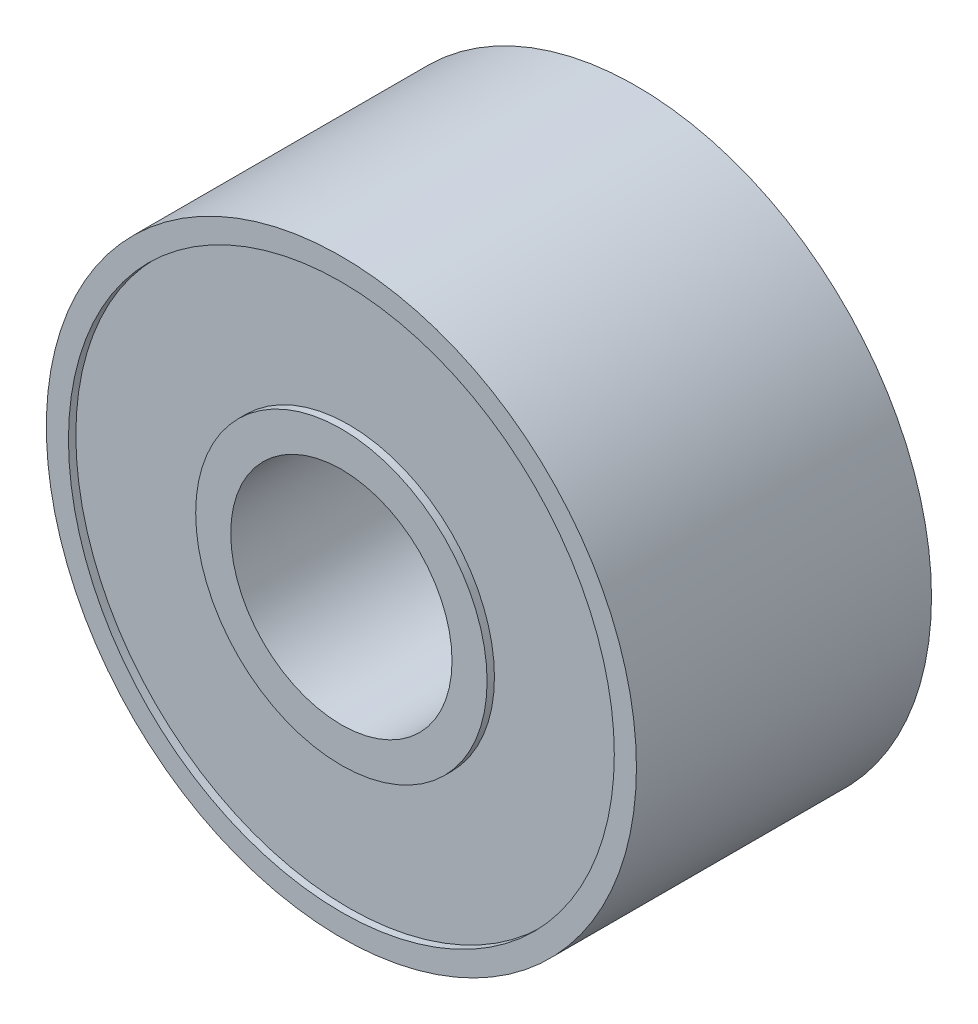
ISO-10303-21;
HEADER;
FILE_DESCRIPTION(('STEP AP214'),'2;1');
FILE_NAME('part.step','',(''),(''),'','','');
FILE_SCHEMA(('AUTOMOTIVE_DESIGN { 1 0 10303 214 1 1 1 1 }'));
ENDSEC;
DATA;
#1=APPLICATION_CONTEXT('core data for automotive mechanical design processes');
#2=APPLICATION_PROTOCOL_DEFINITION('international standard','automotive_design',2000,#1);
#3=PRODUCT_CONTEXT('',#1,'mechanical');
#4=PRODUCT('Part','Part','',(#3));
#5=PRODUCT_RELATED_PRODUCT_CATEGORY('part','',(#4));
#6=PRODUCT_DEFINITION_FORMATION('','',#4);
#7=PRODUCT_DEFINITION_CONTEXT('part definition',#1,'design');
#8=PRODUCT_DEFINITION('design','',#6,#7);
#9=PRODUCT_DEFINITION_SHAPE('','',#8);
#10=(LENGTH_UNIT() NAMED_UNIT(*) SI_UNIT(.MILLI.,.METRE.));
#11=(NAMED_UNIT(*) PLANE_ANGLE_UNIT() SI_UNIT($,.RADIAN.));
#12=(NAMED_UNIT(*) SI_UNIT($,.STERADIAN.) SOLID_ANGLE_UNIT());
#13=UNCERTAINTY_MEASURE_WITH_UNIT(LENGTH_MEASURE(1.E-05),#10,'distance_accuracy_value','');
#14=(GEOMETRIC_REPRESENTATION_CONTEXT(3) GLOBAL_UNCERTAINTY_ASSIGNED_CONTEXT((#13)) GLOBAL_UNIT_ASSIGNED_CONTEXT((#10,
#11,#12)) REPRESENTATION_CONTEXT('',''));
#15=CARTESIAN_POINT('',(0.,0.,0.));
#16=DIRECTION('',(0.,0.,1.));
#17=DIRECTION('',(1.,0.,0.));
#18=AXIS2_PLACEMENT_3D('',#15,#16,#17);
#19=CARTESIAN_POINT('',(0.,0.,0.));
#20=DIRECTION('',(0.,0.,1.));
#21=DIRECTION('',(1.,0.,0.));
#22=AXIS2_PLACEMENT_3D('',#19,#20,#21);
#23=PLANE('',#22);
#24=CARTESIAN_POINT('',(0.,0.,0.));
#25=DIRECTION('',(0.,0.,1.));
#26=DIRECTION('',(1.,0.,0.));
#27=AXIS2_PLACEMENT_3D('',#24,#25,#26);
#28=CIRCLE('',#27,1.5);
#29=CARTESIAN_POINT('',(1.5,0.,0.));
#30=VERTEX_POINT('',#29);
#31=EDGE_CURVE('E43',#30,#30,#28,.T.);
#32=ORIENTED_EDGE('',*,*,#31,.T.);
#33=EDGE_LOOP('',(#32));
#34=FACE_BOUND('',#33,.T.);
#35=CARTESIAN_POINT('',(0.,0.,0.));
#36=DIRECTION('',(0.,0.,-1.));
#37=DIRECTION('',(-1.,0.,0.));
#38=AXIS2_PLACEMENT_3D('',#35,#36,#37);
#39=CIRCLE('',#38,1.97517800346251);
#40=CARTESIAN_POINT('',(-1.97517800346251,0.,0.));
#41=VERTEX_POINT('',#40);
#42=EDGE_CURVE('E65',#41,#41,#39,.T.);
#43=ORIENTED_EDGE('',*,*,#42,.T.);
#44=EDGE_LOOP('',(#43));
#45=FACE_BOUND('',#44,.T.);
#46=ADVANCED_FACE('F30',(#34,#45),#23,.F.);
#47=CARTESIAN_POINT('',(0.,0.,4.));
#48=DIRECTION('',(0.,0.,1.));
#49=DIRECTION('',(1.,0.,0.));
#50=AXIS2_PLACEMENT_3D('',#47,#48,#49);
#51=PLANE('',#50);
#52=CARTESIAN_POINT('',(0.,0.,4.));
#53=DIRECTION('',(0.,0.,1.));
#54=DIRECTION('',(1.,0.,0.));
#55=AXIS2_PLACEMENT_3D('',#52,#53,#54);
#56=CIRCLE('',#55,1.5);
#57=CARTESIAN_POINT('',(1.5,0.,4.));
#58=VERTEX_POINT('',#57);
#59=EDGE_CURVE('E41',#58,#58,#56,.T.);
#60=ORIENTED_EDGE('',*,*,#59,.F.);
#61=EDGE_LOOP('',(#60));
#62=FACE_BOUND('',#61,.T.);
#63=CARTESIAN_POINT('',(0.,0.,4.));
#64=DIRECTION('',(0.,0.,1.));
#65=DIRECTION('',(1.,0.,0.));
#66=AXIS2_PLACEMENT_3D('',#63,#64,#65);
#67=CIRCLE('',#66,1.97517800346251);
#68=CARTESIAN_POINT('',(1.97517800346251,0.,4.));
#69=VERTEX_POINT('',#68);
#70=EDGE_CURVE('E55',#69,#69,#67,.T.);
#71=ORIENTED_EDGE('',*,*,#70,.T.);
#72=EDGE_LOOP('',(#71));
#73=FACE_BOUND('',#72,.T.);
#74=ADVANCED_FACE('F104',(#62,#73),#51,.T.);
#75=CARTESIAN_POINT('',(0.,0.,4.));
#76=DIRECTION('',(0.,0.,1.));
#77=DIRECTION('',(1.,0.,0.));
#78=AXIS2_PLACEMENT_3D('',#75,#76,#77);
#79=CIRCLE('',#78,3.7);
#80=CARTESIAN_POINT('',(3.7,0.,4.));
#81=VERTEX_POINT('',#80);
#82=EDGE_CURVE('E49',#81,#81,#79,.T.);
#83=ORIENTED_EDGE('',*,*,#82,.F.);
#84=EDGE_LOOP('',(#83));
#85=FACE_BOUND('',#84,.T.);
#86=CARTESIAN_POINT('',(0.,0.,4.));
#87=DIRECTION('',(0.,0.,1.));
#88=DIRECTION('',(1.,0.,0.));
#89=AXIS2_PLACEMENT_3D('',#86,#87,#88);
#90=CIRCLE('',#89,4.);
#91=CARTESIAN_POINT('',(4.,0.,4.));
#92=VERTEX_POINT('',#91);
#93=EDGE_CURVE('E10',#92,#92,#90,.T.);
#94=ORIENTED_EDGE('',*,*,#93,.T.);
#95=EDGE_LOOP('',(#94));
#96=FACE_BOUND('',#95,.T.);
#97=ADVANCED_FACE('F91',(#85,#96),#51,.T.);
#98=CARTESIAN_POINT('',(0.,0.,0.));
#99=DIRECTION('',(0.,0.,-1.));
#100=DIRECTION('',(-1.,0.,0.));
#101=AXIS2_PLACEMENT_3D('',#98,#99,#100);
#102=CIRCLE('',#101,3.7);
#103=CARTESIAN_POINT('',(-3.7,0.,0.));
#104=VERTEX_POINT('',#103);
#105=EDGE_CURVE('E61',#104,#104,#102,.T.);
#106=ORIENTED_EDGE('',*,*,#105,.F.);
#107=EDGE_LOOP('',(#106));
#108=FACE_BOUND('',#107,.T.);
#109=CARTESIAN_POINT('',(0.,0.,0.));
#110=DIRECTION('',(0.,0.,1.));
#111=DIRECTION('',(1.,0.,0.));
#112=AXIS2_PLACEMENT_3D('',#109,#110,#111);
#113=CIRCLE('',#112,4.);
#114=CARTESIAN_POINT('',(4.,0.,0.));
#115=VERTEX_POINT('',#114);
#116=EDGE_CURVE('E34',#115,#115,#113,.T.);
#117=ORIENTED_EDGE('',*,*,#116,.F.);
#118=EDGE_LOOP('',(#117));
#119=FACE_BOUND('',#118,.T.);
#120=ADVANCED_FACE('F88',(#108,#119),#23,.F.);
#121=CARTESIAN_POINT('',(0.,0.,4.));
#122=DIRECTION('',(0.,0.,-1.));
#123=DIRECTION('',(-1.,0.,0.));
#124=AXIS2_PLACEMENT_3D('',#121,#122,#123);
#125=CYLINDRICAL_SURFACE('',#124,4.);
#126=ORIENTED_EDGE('',*,*,#93,.F.);
#127=EDGE_LOOP('',(#126));
#128=FACE_BOUND('',#127,.T.);
#129=ORIENTED_EDGE('',*,*,#116,.T.);
#130=EDGE_LOOP('',(#129));
#131=FACE_BOUND('',#130,.T.);
#132=ADVANCED_FACE('F32',(#128,#131),#125,.T.);
#133=CARTESIAN_POINT('',(0.,0.,4.));
#134=DIRECTION('',(0.,0.,-1.));
#135=DIRECTION('',(-1.,0.,0.));
#136=AXIS2_PLACEMENT_3D('',#133,#134,#135);
#137=CYLINDRICAL_SURFACE('',#136,1.5);
#138=ORIENTED_EDGE('',*,*,#59,.T.);
#139=EDGE_LOOP('',(#138));
#140=FACE_BOUND('',#139,.T.);
#141=ORIENTED_EDGE('',*,*,#31,.F.);
#142=EDGE_LOOP('',(#141));
#143=FACE_BOUND('',#142,.T.);
#144=ADVANCED_FACE('F95',(#140,#143),#137,.F.);
#145=CARTESIAN_POINT('',(0.,0.,3.9));
#146=DIRECTION('',(0.,0.,1.));
#147=DIRECTION('',(1.,0.,0.));
#148=AXIS2_PLACEMENT_3D('',#145,#146,#147);
#149=CYLINDRICAL_SURFACE('',#148,3.7);
#150=CARTESIAN_POINT('',(0.,0.,3.9));
#151=DIRECTION('',(0.,0.,1.));
#152=DIRECTION('',(1.,0.,0.));
#153=AXIS2_PLACEMENT_3D('',#150,#151,#152);
#154=CIRCLE('',#153,3.7);
#155=CARTESIAN_POINT('',(3.7,0.,3.9));
#156=VERTEX_POINT('',#155);
#157=EDGE_CURVE('E46',#156,#156,#154,.T.);
#158=ORIENTED_EDGE('',*,*,#157,.F.);
#159=EDGE_LOOP('',(#158));
#160=FACE_BOUND('',#159,.T.);
#161=ORIENTED_EDGE('',*,*,#82,.T.);
#162=EDGE_LOOP('',(#161));
#163=FACE_BOUND('',#162,.T.);
#164=ADVANCED_FACE('F100',(#160,#163),#149,.F.);
#165=CARTESIAN_POINT('',(0.,0.,3.9));
#166=DIRECTION('',(0.,0.,1.));
#167=DIRECTION('',(1.,0.,0.));
#168=AXIS2_PLACEMENT_3D('',#165,#166,#167);
#169=PLANE('',#168);
#170=CARTESIAN_POINT('',(0.,0.,3.9));
#171=DIRECTION('',(0.,0.,1.));
#172=DIRECTION('',(1.,0.,0.));
#173=AXIS2_PLACEMENT_3D('',#170,#171,#172);
#174=CIRCLE('',#173,1.97517800346251);
#175=CARTESIAN_POINT('',(1.97517800346251,0.,3.9));
#176=VERTEX_POINT('',#175);
#177=EDGE_CURVE('E52',#176,#176,#174,.T.);
#178=ORIENTED_EDGE('',*,*,#177,.F.);
#179=EDGE_LOOP('',(#178));
#180=FACE_BOUND('',#179,.T.);
#181=ORIENTED_EDGE('',*,*,#157,.T.);
#182=EDGE_LOOP('',(#181));
#183=FACE_BOUND('',#182,.T.);
#184=ADVANCED_FACE('F117',(#180,#183),#169,.T.);
#185=CARTESIAN_POINT('',(0.,0.,3.9));
#186=DIRECTION('',(0.,0.,1.));
#187=DIRECTION('',(1.,0.,0.));
#188=AXIS2_PLACEMENT_3D('',#185,#186,#187);
#189=CYLINDRICAL_SURFACE('',#188,1.97517800346251);
#190=ORIENTED_EDGE('',*,*,#177,.T.);
#191=EDGE_LOOP('',(#190));
#192=FACE_BOUND('',#191,.T.);
#193=ORIENTED_EDGE('',*,*,#70,.F.);
#194=EDGE_LOOP('',(#193));
#195=FACE_BOUND('',#194,.T.);
#196=ADVANCED_FACE('F121',(#192,#195),#189,.T.);
#197=CARTESIAN_POINT('',(0.,0.,0.1));
#198=DIRECTION('',(0.,0.,-1.));
#199=DIRECTION('',(-1.,0.,0.));
#200=AXIS2_PLACEMENT_3D('',#197,#198,#199);
#201=CYLINDRICAL_SURFACE('',#200,1.97517800346251);
#202=CARTESIAN_POINT('',(0.,0.,0.1));
#203=DIRECTION('',(0.,0.,-1.));
#204=DIRECTION('',(-1.,0.,0.));
#205=AXIS2_PLACEMENT_3D('',#202,#203,#204);
#206=CIRCLE('',#205,1.97517800346251);
#207=CARTESIAN_POINT('',(-1.97517800346251,0.,0.1));
#208=VERTEX_POINT('',#207);
#209=EDGE_CURVE('E64',#208,#208,#206,.T.);
#210=ORIENTED_EDGE('',*,*,#209,.T.);
#211=EDGE_LOOP('',(#210));
#212=FACE_BOUND('',#211,.T.);
#213=ORIENTED_EDGE('',*,*,#42,.F.);
#214=EDGE_LOOP('',(#213));
#215=FACE_BOUND('',#214,.T.);
#216=ADVANCED_FACE('F73',(#212,#215),#201,.T.);
#217=CARTESIAN_POINT('',(0.,0.,0.1));
#218=DIRECTION('',(0.,0.,-1.));
#219=DIRECTION('',(-1.,0.,0.));
#220=AXIS2_PLACEMENT_3D('',#217,#218,#219);
#221=CYLINDRICAL_SURFACE('',#220,3.7);
#222=CARTESIAN_POINT('',(0.,0.,0.1));
#223=DIRECTION('',(0.,0.,-1.));
#224=DIRECTION('',(-1.,0.,0.));
#225=AXIS2_PLACEMENT_3D('',#222,#223,#224);
#226=CIRCLE('',#225,3.7);
#227=CARTESIAN_POINT('',(-3.7,0.,0.1));
#228=VERTEX_POINT('',#227);
#229=EDGE_CURVE('E58',#228,#228,#226,.T.);
#230=ORIENTED_EDGE('',*,*,#229,.F.);
#231=EDGE_LOOP('',(#230));
#232=FACE_BOUND('',#231,.T.);
#233=ORIENTED_EDGE('',*,*,#105,.T.);
#234=EDGE_LOOP('',(#233));
#235=FACE_BOUND('',#234,.T.);
#236=ADVANCED_FACE('F79',(#232,#235),#221,.F.);
#237=CARTESIAN_POINT('',(0.,0.,0.1));
#238=DIRECTION('',(0.,0.,-1.));
#239=DIRECTION('',(-1.,0.,0.));
#240=AXIS2_PLACEMENT_3D('',#237,#238,#239);
#241=PLANE('',#240);
#242=ORIENTED_EDGE('',*,*,#209,.F.);
#243=EDGE_LOOP('',(#242));
#244=FACE_BOUND('',#243,.T.);
#245=ORIENTED_EDGE('',*,*,#229,.T.);
#246=EDGE_LOOP('',(#245));
#247=FACE_BOUND('',#246,.T.);
#248=ADVANCED_FACE('F76',(#244,#247),#241,.T.);
#249=CLOSED_SHELL('',(#46,#74,#97,#120,#132,#144,#164,#184,#196,#216,#236,#248));
#250=MANIFOLD_SOLID_BREP('B2',#249);
#251=ADVANCED_BREP_SHAPE_REPRESENTATION('',(#18,#250),#14);
#252=SHAPE_DEFINITION_REPRESENTATION(#9,#251);
ENDSEC;
END-ISO-10303-21;
